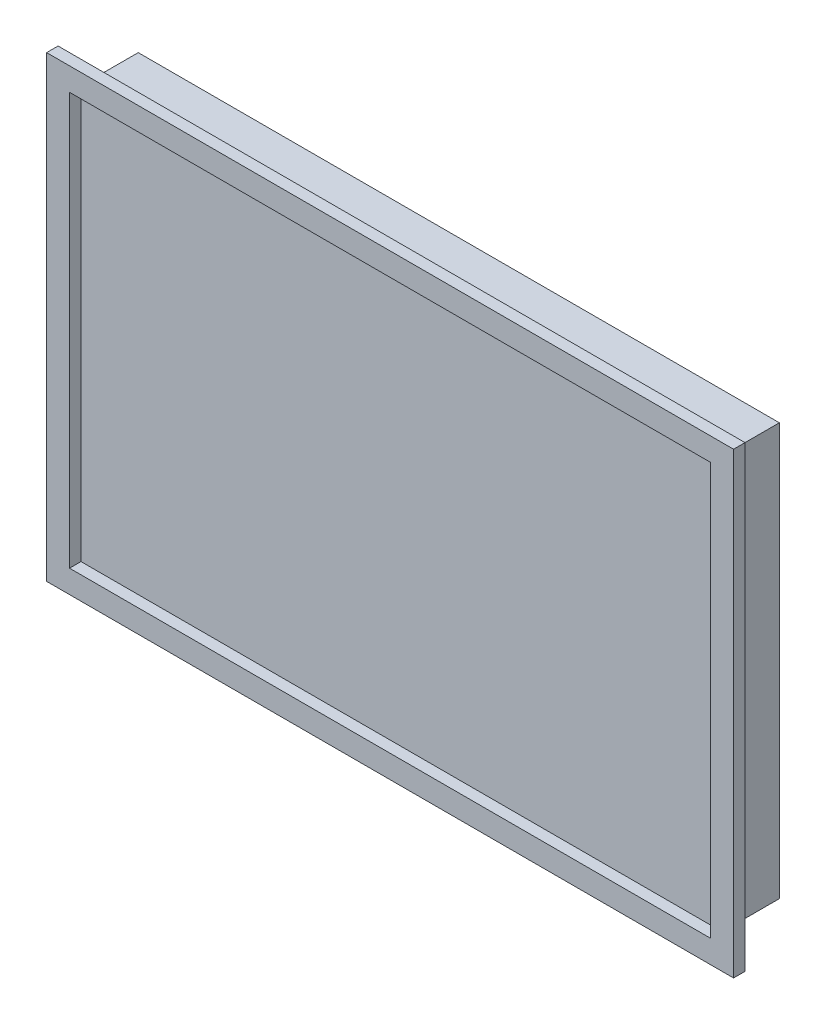
ISO-10303-21;
HEADER;
FILE_DESCRIPTION(('STEP AP214'),'2;1');
FILE_NAME('part.step','',(''),(''),'','','');
FILE_SCHEMA(('AUTOMOTIVE_DESIGN { 1 0 10303 214 1 1 1 1 }'));
ENDSEC;
DATA;
#1=APPLICATION_CONTEXT('core data for automotive mechanical design processes');
#2=APPLICATION_PROTOCOL_DEFINITION('international standard','automotive_design',2000,#1);
#3=PRODUCT_CONTEXT('',#1,'mechanical');
#4=PRODUCT('Part','Part','',(#3));
#5=PRODUCT_RELATED_PRODUCT_CATEGORY('part','',(#4));
#6=PRODUCT_DEFINITION_FORMATION('','',#4);
#7=PRODUCT_DEFINITION_CONTEXT('part definition',#1,'design');
#8=PRODUCT_DEFINITION('design','',#6,#7);
#9=PRODUCT_DEFINITION_SHAPE('','',#8);
#10=(LENGTH_UNIT() NAMED_UNIT(*) SI_UNIT(.MILLI.,.METRE.));
#11=(NAMED_UNIT(*) PLANE_ANGLE_UNIT() SI_UNIT($,.RADIAN.));
#12=(NAMED_UNIT(*) SI_UNIT($,.STERADIAN.) SOLID_ANGLE_UNIT());
#13=UNCERTAINTY_MEASURE_WITH_UNIT(LENGTH_MEASURE(1.E-05),#10,'distance_accuracy_value','');
#14=(GEOMETRIC_REPRESENTATION_CONTEXT(3) GLOBAL_UNCERTAINTY_ASSIGNED_CONTEXT((#13)) GLOBAL_UNIT_ASSIGNED_CONTEXT((#10,
#11,#12)) REPRESENTATION_CONTEXT('',''));
#15=CARTESIAN_POINT('',(0.,0.,0.));
#16=DIRECTION('',(0.,0.,1.));
#17=DIRECTION('',(1.,0.,0.));
#18=AXIS2_PLACEMENT_3D('',#15,#16,#17);
#19=CARTESIAN_POINT('',(-150.,-100.,30.));
#20=DIRECTION('',(1.,0.,0.));
#21=DIRECTION('',(0.,0.,-1.));
#22=AXIS2_PLACEMENT_3D('',#19,#20,#21);
#23=PLANE('',#22);
#24=DIRECTION('',(0.,1.,0.));
#25=VECTOR('',#24,1.);
#26=CARTESIAN_POINT('',(-150.,-100.,25.));
#27=LINE('',#26,#25);
#28=CARTESIAN_POINT('',(-150.,-100.,25.));
#29=VERTEX_POINT('',#28);
#30=CARTESIAN_POINT('',(-150.,100.,25.));
#31=VERTEX_POINT('',#30);
#32=EDGE_CURVE('E119',#29,#31,#27,.T.);
#33=ORIENTED_EDGE('',*,*,#32,.F.);
#34=DIRECTION('',(0.,0.,-1.));
#35=VECTOR('',#34,1.);
#36=CARTESIAN_POINT('',(-150.,-100.,30.));
#37=LINE('',#36,#35);
#38=CARTESIAN_POINT('',(-150.,-100.,30.));
#39=VERTEX_POINT('',#38);
#40=EDGE_CURVE('E141',#39,#29,#37,.T.);
#41=ORIENTED_EDGE('',*,*,#40,.F.);
#42=DIRECTION('',(0.,-1.,0.));
#43=VECTOR('',#42,1.);
#44=CARTESIAN_POINT('',(-150.,-100.,30.));
#45=LINE('',#44,#43);
#46=CARTESIAN_POINT('',(-150.,100.,30.));
#47=VERTEX_POINT('',#46);
#48=EDGE_CURVE('E140',#47,#39,#45,.T.);
#49=ORIENTED_EDGE('',*,*,#48,.F.);
#50=DIRECTION('',(0.,0.,-1.));
#51=VECTOR('',#50,1.);
#52=CARTESIAN_POINT('',(-150.,100.,30.));
#53=LINE('',#52,#51);
#54=EDGE_CURVE('E134',#47,#31,#53,.T.);
#55=ORIENTED_EDGE('',*,*,#54,.T.);
#56=EDGE_LOOP('',(#33,#41,#49,#55));
#57=FACE_BOUND('',#56,.T.);
#58=ADVANCED_FACE('F48',(#57),#23,.F.);
#59=CARTESIAN_POINT('',(150.,-100.,30.));
#60=DIRECTION('',(0.,1.,0.));
#61=DIRECTION('',(-1.,0.,0.));
#62=AXIS2_PLACEMENT_3D('',#59,#60,#61);
#63=PLANE('',#62);
#64=DIRECTION('',(-1.,0.,0.));
#65=VECTOR('',#64,1.);
#66=CARTESIAN_POINT('',(150.,-100.,25.));
#67=LINE('',#66,#65);
#68=CARTESIAN_POINT('',(150.,-100.,25.));
#69=VERTEX_POINT('',#68);
#70=EDGE_CURVE('E13',#69,#29,#67,.T.);
#71=ORIENTED_EDGE('',*,*,#70,.F.);
#72=DIRECTION('',(0.,0.,-1.));
#73=VECTOR('',#72,1.);
#74=CARTESIAN_POINT('',(150.,-100.,30.));
#75=LINE('',#74,#73);
#76=CARTESIAN_POINT('',(150.,-100.,30.));
#77=VERTEX_POINT('',#76);
#78=EDGE_CURVE('E143',#77,#69,#75,.T.);
#79=ORIENTED_EDGE('',*,*,#78,.F.);
#80=DIRECTION('',(1.,0.,0.));
#81=VECTOR('',#80,1.);
#82=CARTESIAN_POINT('',(150.,-100.,30.));
#83=LINE('',#82,#81);
#84=EDGE_CURVE('E153',#39,#77,#83,.T.);
#85=ORIENTED_EDGE('',*,*,#84,.F.);
#86=ORIENTED_EDGE('',*,*,#40,.T.);
#87=EDGE_LOOP('',(#71,#79,#85,#86));
#88=FACE_BOUND('',#87,.T.);
#89=ADVANCED_FACE('F194',(#88),#63,.F.);
#90=CARTESIAN_POINT('',(150.,-100.,30.));
#91=DIRECTION('',(-1.,0.,0.));
#92=DIRECTION('',(0.,0.,1.));
#93=AXIS2_PLACEMENT_3D('',#90,#91,#92);
#94=PLANE('',#93);
#95=DIRECTION('',(0.,-1.,0.));
#96=VECTOR('',#95,1.);
#97=CARTESIAN_POINT('',(150.,-100.,25.));
#98=LINE('',#97,#96);
#99=CARTESIAN_POINT('',(150.,100.,25.));
#100=VERTEX_POINT('',#99);
#101=EDGE_CURVE('E58',#100,#69,#98,.T.);
#102=ORIENTED_EDGE('',*,*,#101,.F.);
#103=DIRECTION('',(0.,0.,-1.));
#104=VECTOR('',#103,1.);
#105=CARTESIAN_POINT('',(150.,100.,30.));
#106=LINE('',#105,#104);
#107=CARTESIAN_POINT('',(150.,100.,30.));
#108=VERTEX_POINT('',#107);
#109=EDGE_CURVE('E137',#108,#100,#106,.T.);
#110=ORIENTED_EDGE('',*,*,#109,.F.);
#111=DIRECTION('',(0.,1.,0.));
#112=VECTOR('',#111,1.);
#113=CARTESIAN_POINT('',(150.,-100.,30.));
#114=LINE('',#113,#112);
#115=EDGE_CURVE('E151',#77,#108,#114,.T.);
#116=ORIENTED_EDGE('',*,*,#115,.F.);
#117=ORIENTED_EDGE('',*,*,#78,.T.);
#118=EDGE_LOOP('',(#102,#110,#116,#117));
#119=FACE_BOUND('',#118,.T.);
#120=ADVANCED_FACE('F198',(#119),#94,.F.);
#121=CARTESIAN_POINT('',(150.,100.,30.));
#122=DIRECTION('',(0.,-1.,0.));
#123=DIRECTION('',(1.,0.,0.));
#124=AXIS2_PLACEMENT_3D('',#121,#122,#123);
#125=PLANE('',#124);
#126=DIRECTION('',(1.,0.,0.));
#127=VECTOR('',#126,1.);
#128=CARTESIAN_POINT('',(150.,100.,25.));
#129=LINE('',#128,#127);
#130=EDGE_CURVE('E121',#31,#100,#129,.T.);
#131=ORIENTED_EDGE('',*,*,#130,.F.);
#132=ORIENTED_EDGE('',*,*,#54,.F.);
#133=DIRECTION('',(-1.,0.,0.));
#134=VECTOR('',#133,1.);
#135=CARTESIAN_POINT('',(150.,100.,30.));
#136=LINE('',#135,#134);
#137=EDGE_CURVE('E148',#108,#47,#136,.T.);
#138=ORIENTED_EDGE('',*,*,#137,.F.);
#139=ORIENTED_EDGE('',*,*,#109,.T.);
#140=EDGE_LOOP('',(#131,#132,#138,#139));
#141=FACE_BOUND('',#140,.T.);
#142=ADVANCED_FACE('F132',(#141),#125,.F.);
#143=CARTESIAN_POINT('',(0.,0.,30.));
#144=DIRECTION('',(0.,0.,1.));
#145=DIRECTION('',(1.,0.,0.));
#146=AXIS2_PLACEMENT_3D('',#143,#144,#145);
#147=PLANE('',#146);
#148=DIRECTION('',(0.,-1.,0.));
#149=VECTOR('',#148,1.);
#150=CARTESIAN_POINT('',(-140.,-90.,30.));
#151=LINE('',#150,#149);
#152=CARTESIAN_POINT('',(-140.,90.,30.));
#153=VERTEX_POINT('',#152);
#154=CARTESIAN_POINT('',(-140.,-90.,30.));
#155=VERTEX_POINT('',#154);
#156=EDGE_CURVE('E150',#153,#155,#151,.T.);
#157=ORIENTED_EDGE('',*,*,#156,.F.);
#158=DIRECTION('',(-1.,0.,0.));
#159=VECTOR('',#158,1.);
#160=CARTESIAN_POINT('',(140.,90.,30.));
#161=LINE('',#160,#159);
#162=CARTESIAN_POINT('',(140.,90.,30.));
#163=VERTEX_POINT('',#162);
#164=EDGE_CURVE('E163',#163,#153,#161,.T.);
#165=ORIENTED_EDGE('',*,*,#164,.F.);
#166=DIRECTION('',(0.,1.,0.));
#167=VECTOR('',#166,1.);
#168=CARTESIAN_POINT('',(140.,-90.,30.));
#169=LINE('',#168,#167);
#170=CARTESIAN_POINT('',(140.,-90.,30.));
#171=VERTEX_POINT('',#170);
#172=EDGE_CURVE('E161',#171,#163,#169,.T.);
#173=ORIENTED_EDGE('',*,*,#172,.F.);
#174=DIRECTION('',(1.,0.,0.));
#175=VECTOR('',#174,1.);
#176=CARTESIAN_POINT('',(140.,-90.,30.));
#177=LINE('',#176,#175);
#178=EDGE_CURVE('E159',#155,#171,#177,.T.);
#179=ORIENTED_EDGE('',*,*,#178,.F.);
#180=EDGE_LOOP('',(#157,#165,#173,#179));
#181=FACE_BOUND('',#180,.T.);
#182=ORIENTED_EDGE('',*,*,#48,.T.);
#183=ORIENTED_EDGE('',*,*,#84,.T.);
#184=ORIENTED_EDGE('',*,*,#115,.T.);
#185=ORIENTED_EDGE('',*,*,#137,.T.);
#186=EDGE_LOOP('',(#182,#183,#184,#185));
#187=FACE_BOUND('',#186,.T.);
#188=ADVANCED_FACE('F188',(#181,#187),#147,.T.);
#189=CARTESIAN_POINT('',(-140.,-90.,25.));
#190=DIRECTION('',(-1.,0.,0.));
#191=DIRECTION('',(0.,0.,1.));
#192=AXIS2_PLACEMENT_3D('',#189,#190,#191);
#193=PLANE('',#192);
#194=ORIENTED_EDGE('',*,*,#156,.T.);
#195=DIRECTION('',(0.,0.,1.));
#196=VECTOR('',#195,1.);
#197=CARTESIAN_POINT('',(-140.,-90.,25.));
#198=LINE('',#197,#196);
#199=CARTESIAN_POINT('',(-140.,-90.,25.));
#200=VERTEX_POINT('',#199);
#201=EDGE_CURVE('E156',#200,#155,#198,.T.);
#202=ORIENTED_EDGE('',*,*,#201,.F.);
#203=DIRECTION('',(0.,-1.,0.));
#204=VECTOR('',#203,1.);
#205=CARTESIAN_POINT('',(-140.,-90.,25.));
#206=LINE('',#205,#204);
#207=CARTESIAN_POINT('',(-140.,90.,25.));
#208=VERTEX_POINT('',#207);
#209=EDGE_CURVE('E171',#208,#200,#206,.T.);
#210=ORIENTED_EDGE('',*,*,#209,.F.);
#211=DIRECTION('',(0.,0.,1.));
#212=VECTOR('',#211,1.);
#213=CARTESIAN_POINT('',(-140.,90.,25.));
#214=LINE('',#213,#212);
#215=EDGE_CURVE('E164',#208,#153,#214,.T.);
#216=ORIENTED_EDGE('',*,*,#215,.T.);
#217=EDGE_LOOP('',(#194,#202,#210,#216));
#218=FACE_BOUND('',#217,.T.);
#219=ADVANCED_FACE('F186',(#218),#193,.F.);
#220=CARTESIAN_POINT('',(140.,90.,25.));
#221=DIRECTION('',(0.,1.,0.));
#222=DIRECTION('',(0.,0.,1.));
#223=AXIS2_PLACEMENT_3D('',#220,#221,#222);
#224=PLANE('',#223);
#225=ORIENTED_EDGE('',*,*,#164,.T.);
#226=ORIENTED_EDGE('',*,*,#215,.F.);
#227=DIRECTION('',(-1.,0.,0.));
#228=VECTOR('',#227,1.);
#229=CARTESIAN_POINT('',(140.,90.,25.));
#230=LINE('',#229,#228);
#231=CARTESIAN_POINT('',(140.,90.,25.));
#232=VERTEX_POINT('',#231);
#233=EDGE_CURVE('E84',#232,#208,#230,.T.);
#234=ORIENTED_EDGE('',*,*,#233,.F.);
#235=DIRECTION('',(0.,0.,1.));
#236=VECTOR('',#235,1.);
#237=CARTESIAN_POINT('',(140.,90.,25.));
#238=LINE('',#237,#236);
#239=EDGE_CURVE('E100',#232,#163,#238,.T.);
#240=ORIENTED_EDGE('',*,*,#239,.T.);
#241=EDGE_LOOP('',(#225,#226,#234,#240));
#242=FACE_BOUND('',#241,.T.);
#243=ADVANCED_FACE('F183',(#242),#224,.F.);
#244=CARTESIAN_POINT('',(140.,-90.,25.));
#245=DIRECTION('',(1.,0.,0.));
#246=DIRECTION('',(0.,0.,-1.));
#247=AXIS2_PLACEMENT_3D('',#244,#245,#246);
#248=PLANE('',#247);
#249=ORIENTED_EDGE('',*,*,#172,.T.);
#250=ORIENTED_EDGE('',*,*,#239,.F.);
#251=DIRECTION('',(0.,1.,0.));
#252=VECTOR('',#251,1.);
#253=CARTESIAN_POINT('',(140.,-90.,25.));
#254=LINE('',#253,#252);
#255=CARTESIAN_POINT('',(140.,-90.,25.));
#256=VERTEX_POINT('',#255);
#257=EDGE_CURVE('E127',#256,#232,#254,.T.);
#258=ORIENTED_EDGE('',*,*,#257,.F.);
#259=DIRECTION('',(0.,0.,1.));
#260=VECTOR('',#259,1.);
#261=CARTESIAN_POINT('',(140.,-90.,25.));
#262=LINE('',#261,#260);
#263=EDGE_CURVE('E93',#256,#171,#262,.T.);
#264=ORIENTED_EDGE('',*,*,#263,.T.);
#265=EDGE_LOOP('',(#249,#250,#258,#264));
#266=FACE_BOUND('',#265,.T.);
#267=ADVANCED_FACE('F181',(#266),#248,.F.);
#268=CARTESIAN_POINT('',(140.,-90.,25.));
#269=DIRECTION('',(0.,-1.,0.));
#270=DIRECTION('',(0.,0.,-1.));
#271=AXIS2_PLACEMENT_3D('',#268,#269,#270);
#272=PLANE('',#271);
#273=ORIENTED_EDGE('',*,*,#178,.T.);
#274=ORIENTED_EDGE('',*,*,#263,.F.);
#275=DIRECTION('',(1.,0.,0.));
#276=VECTOR('',#275,1.);
#277=CARTESIAN_POINT('',(140.,-90.,25.));
#278=LINE('',#277,#276);
#279=EDGE_CURVE('E52',#200,#256,#278,.T.);
#280=ORIENTED_EDGE('',*,*,#279,.F.);
#281=ORIENTED_EDGE('',*,*,#201,.T.);
#282=EDGE_LOOP('',(#273,#274,#280,#281));
#283=FACE_BOUND('',#282,.T.);
#284=ADVANCED_FACE('F178',(#283),#272,.F.);
#285=CARTESIAN_POINT('',(0.,0.,25.));
#286=DIRECTION('',(0.,0.,-1.));
#287=DIRECTION('',(-1.,0.,0.));
#288=AXIS2_PLACEMENT_3D('',#285,#286,#287);
#289=PLANE('',#288);
#290=ORIENTED_EDGE('',*,*,#233,.T.);
#291=ORIENTED_EDGE('',*,*,#209,.T.);
#292=ORIENTED_EDGE('',*,*,#279,.T.);
#293=ORIENTED_EDGE('',*,*,#257,.T.);
#294=EDGE_LOOP('',(#290,#291,#292,#293));
#295=FACE_BOUND('',#294,.T.);
#296=ORIENTED_EDGE('',*,*,#32,.T.);
#297=ORIENTED_EDGE('',*,*,#130,.T.);
#298=ORIENTED_EDGE('',*,*,#101,.T.);
#299=ORIENTED_EDGE('',*,*,#70,.T.);
#300=EDGE_LOOP('',(#296,#297,#298,#299));
#301=FACE_BOUND('',#300,.T.);
#302=ADVANCED_FACE('F50',(#295,#301),#289,.T.);
#303=CLOSED_SHELL('',(#58,#89,#120,#142,#188,#219,#243,#267,#284,#302));
#304=MANIFOLD_SOLID_BREP('B2',#303);
#305=CARTESIAN_POINT('',(0.,0.,25.));
#306=DIRECTION('',(0.,0.,1.));
#307=DIRECTION('',(1.,0.,0.));
#308=AXIS2_PLACEMENT_3D('',#305,#306,#307);
#309=PLANE('',#308);
#310=DIRECTION('',(0.,-1.,0.));
#311=VECTOR('',#310,1.);
#312=CARTESIAN_POINT('',(-140.,-90.,25.));
#313=LINE('',#312,#311);
#314=CARTESIAN_POINT('',(-140.,90.,25.));
#315=VERTEX_POINT('',#314);
#316=CARTESIAN_POINT('',(-140.,-90.,25.));
#317=VERTEX_POINT('',#316);
#318=EDGE_CURVE('E46',#315,#317,#313,.T.);
#319=ORIENTED_EDGE('',*,*,#318,.T.);
#320=DIRECTION('',(1.,0.,0.));
#321=VECTOR('',#320,1.);
#322=CARTESIAN_POINT('',(140.,-90.,25.));
#323=LINE('',#322,#321);
#324=CARTESIAN_POINT('',(140.,-90.,25.));
#325=VERTEX_POINT('',#324);
#326=EDGE_CURVE('E341',#317,#325,#323,.T.);
#327=ORIENTED_EDGE('',*,*,#326,.T.);
#328=DIRECTION('',(0.,1.,0.));
#329=VECTOR('',#328,1.);
#330=CARTESIAN_POINT('',(140.,-90.,25.));
#331=LINE('',#330,#329);
#332=CARTESIAN_POINT('',(140.,90.,25.));
#333=VERTEX_POINT('',#332);
#334=EDGE_CURVE('E346',#325,#333,#331,.T.);
#335=ORIENTED_EDGE('',*,*,#334,.T.);
#336=DIRECTION('',(-1.,0.,0.));
#337=VECTOR('',#336,1.);
#338=CARTESIAN_POINT('',(140.,90.,25.));
#339=LINE('',#338,#337);
#340=EDGE_CURVE('E282',#333,#315,#339,.T.);
#341=ORIENTED_EDGE('',*,*,#340,.T.);
#342=EDGE_LOOP('',(#319,#327,#335,#341));
#343=FACE_BOUND('',#342,.T.);
#344=ADVANCED_FACE('F278',(#343),#309,.T.);
#345=CARTESIAN_POINT('',(-140.,-90.,25.));
#346=DIRECTION('',(0.,-1.,0.));
#347=DIRECTION('',(0.,0.,-1.));
#348=AXIS2_PLACEMENT_3D('',#345,#346,#347);
#349=PLANE('',#348);
#350=DIRECTION('',(-1.,0.,0.));
#351=VECTOR('',#350,1.);
#352=CARTESIAN_POINT('',(-140.,-90.,0.));
#353=LINE('',#352,#351);
#354=CARTESIAN_POINT('',(140.,-90.,0.));
#355=VERTEX_POINT('',#354);
#356=CARTESIAN_POINT('',(-140.,-90.,0.));
#357=VERTEX_POINT('',#356);
#358=EDGE_CURVE('E335',#355,#357,#353,.T.);
#359=ORIENTED_EDGE('',*,*,#358,.F.);
#360=DIRECTION('',(0.,0.,-1.));
#361=VECTOR('',#360,1.);
#362=CARTESIAN_POINT('',(140.,-90.,25.));
#363=LINE('',#362,#361);
#364=EDGE_CURVE('E331',#325,#355,#363,.T.);
#365=ORIENTED_EDGE('',*,*,#364,.F.);
#366=ORIENTED_EDGE('',*,*,#326,.F.);
#367=DIRECTION('',(0.,0.,-1.));
#368=VECTOR('',#367,1.);
#369=CARTESIAN_POINT('',(-140.,-90.,25.));
#370=LINE('',#369,#368);
#371=EDGE_CURVE('E324',#317,#357,#370,.T.);
#372=ORIENTED_EDGE('',*,*,#371,.T.);
#373=EDGE_LOOP('',(#359,#365,#366,#372));
#374=FACE_BOUND('',#373,.T.);
#375=ADVANCED_FACE('F351',(#374),#349,.T.);
#376=CARTESIAN_POINT('',(-140.,-90.,25.));
#377=DIRECTION('',(-1.,0.,0.));
#378=DIRECTION('',(0.,0.,1.));
#379=AXIS2_PLACEMENT_3D('',#376,#377,#378);
#380=PLANE('',#379);
#381=DIRECTION('',(0.,1.,0.));
#382=VECTOR('',#381,1.);
#383=CARTESIAN_POINT('',(-140.,-90.,0.));
#384=LINE('',#383,#382);
#385=CARTESIAN_POINT('',(-140.,90.,0.));
#386=VERTEX_POINT('',#385);
#387=EDGE_CURVE('E321',#357,#386,#384,.T.);
#388=ORIENTED_EDGE('',*,*,#387,.F.);
#389=ORIENTED_EDGE('',*,*,#371,.F.);
#390=ORIENTED_EDGE('',*,*,#318,.F.);
#391=DIRECTION('',(0.,0.,-1.));
#392=VECTOR('',#391,1.);
#393=CARTESIAN_POINT('',(-140.,90.,25.));
#394=LINE('',#393,#392);
#395=EDGE_CURVE('E294',#315,#386,#394,.T.);
#396=ORIENTED_EDGE('',*,*,#395,.T.);
#397=EDGE_LOOP('',(#388,#389,#390,#396));
#398=FACE_BOUND('',#397,.T.);
#399=ADVANCED_FACE('F318',(#398),#380,.T.);
#400=CARTESIAN_POINT('',(-140.,90.,25.));
#401=DIRECTION('',(0.,1.,0.));
#402=DIRECTION('',(0.,0.,1.));
#403=AXIS2_PLACEMENT_3D('',#400,#401,#402);
#404=PLANE('',#403);
#405=DIRECTION('',(1.,0.,0.));
#406=VECTOR('',#405,1.);
#407=CARTESIAN_POINT('',(-140.,90.,0.));
#408=LINE('',#407,#406);
#409=CARTESIAN_POINT('',(140.,90.,0.));
#410=VERTEX_POINT('',#409);
#411=EDGE_CURVE('E327',#386,#410,#408,.T.);
#412=ORIENTED_EDGE('',*,*,#411,.F.);
#413=ORIENTED_EDGE('',*,*,#395,.F.);
#414=ORIENTED_EDGE('',*,*,#340,.F.);
#415=DIRECTION('',(0.,0.,-1.));
#416=VECTOR('',#415,1.);
#417=CARTESIAN_POINT('',(140.,90.,25.));
#418=LINE('',#417,#416);
#419=EDGE_CURVE('E302',#333,#410,#418,.T.);
#420=ORIENTED_EDGE('',*,*,#419,.T.);
#421=EDGE_LOOP('',(#412,#413,#414,#420));
#422=FACE_BOUND('',#421,.T.);
#423=ADVANCED_FACE('F328',(#422),#404,.T.);
#424=CARTESIAN_POINT('',(140.,-90.,25.));
#425=DIRECTION('',(1.,0.,0.));
#426=DIRECTION('',(0.,0.,-1.));
#427=AXIS2_PLACEMENT_3D('',#424,#425,#426);
#428=PLANE('',#427);
#429=DIRECTION('',(0.,-1.,0.));
#430=VECTOR('',#429,1.);
#431=CARTESIAN_POINT('',(140.,-90.,0.));
#432=LINE('',#431,#430);
#433=EDGE_CURVE('E337',#410,#355,#432,.T.);
#434=ORIENTED_EDGE('',*,*,#433,.F.);
#435=ORIENTED_EDGE('',*,*,#419,.F.);
#436=ORIENTED_EDGE('',*,*,#334,.F.);
#437=ORIENTED_EDGE('',*,*,#364,.T.);
#438=EDGE_LOOP('',(#434,#435,#436,#437));
#439=FACE_BOUND('',#438,.T.);
#440=ADVANCED_FACE('F352',(#439),#428,.T.);
#441=CARTESIAN_POINT('',(0.,0.,0.));
#442=DIRECTION('',(0.,0.,1.));
#443=DIRECTION('',(1.,0.,0.));
#444=AXIS2_PLACEMENT_3D('',#441,#442,#443);
#445=PLANE('',#444);
#446=ORIENTED_EDGE('',*,*,#433,.T.);
#447=ORIENTED_EDGE('',*,*,#358,.T.);
#448=ORIENTED_EDGE('',*,*,#387,.T.);
#449=ORIENTED_EDGE('',*,*,#411,.T.);
#450=EDGE_LOOP('',(#446,#447,#448,#449));
#451=FACE_BOUND('',#450,.T.);
#452=ADVANCED_FACE('F280',(#451),#445,.F.);
#453=CLOSED_SHELL('',(#344,#375,#399,#423,#440,#452));
#454=MANIFOLD_SOLID_BREP('B7',#453);
#455=ADVANCED_BREP_SHAPE_REPRESENTATION('',(#18,#304,#454),#14);
#456=SHAPE_DEFINITION_REPRESENTATION(#9,#455);
ENDSEC;
END-ISO-10303-21;
